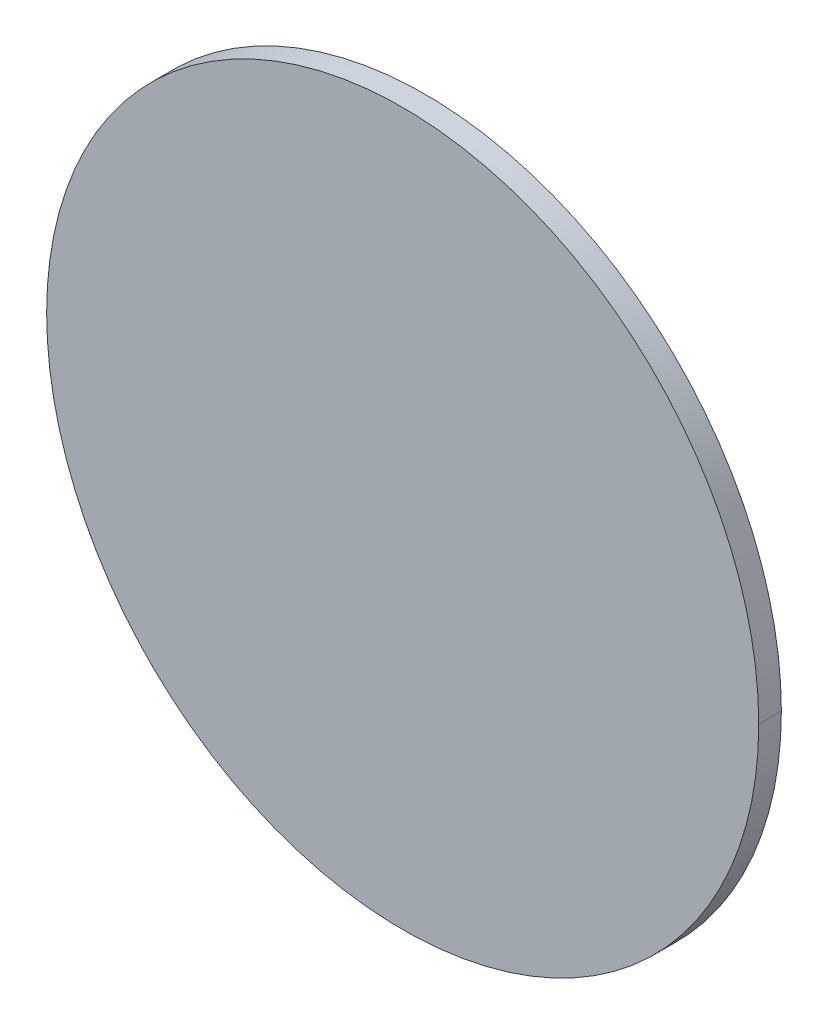
ISO-10303-21;
HEADER;
FILE_DESCRIPTION(('STEP AP214'),'2;1');
FILE_NAME('part.step','',(''),(''),'','','');
FILE_SCHEMA(('AUTOMOTIVE_DESIGN { 1 0 10303 214 1 1 1 1 }'));
ENDSEC;
DATA;
#1=APPLICATION_CONTEXT('core data for automotive mechanical design processes');
#2=APPLICATION_PROTOCOL_DEFINITION('international standard','automotive_design',2000,#1);
#3=PRODUCT_CONTEXT('',#1,'mechanical');
#4=PRODUCT('Part','Part','',(#3));
#5=PRODUCT_RELATED_PRODUCT_CATEGORY('part','',(#4));
#6=PRODUCT_DEFINITION_FORMATION('','',#4);
#7=PRODUCT_DEFINITION_CONTEXT('part definition',#1,'design');
#8=PRODUCT_DEFINITION('design','',#6,#7);
#9=PRODUCT_DEFINITION_SHAPE('','',#8);
#10=(LENGTH_UNIT() NAMED_UNIT(*) SI_UNIT(.MILLI.,.METRE.));
#11=(NAMED_UNIT(*) PLANE_ANGLE_UNIT() SI_UNIT($,.RADIAN.));
#12=(NAMED_UNIT(*) SI_UNIT($,.STERADIAN.) SOLID_ANGLE_UNIT());
#13=UNCERTAINTY_MEASURE_WITH_UNIT(LENGTH_MEASURE(1.E-05),#10,'distance_accuracy_value','');
#14=(GEOMETRIC_REPRESENTATION_CONTEXT(3) GLOBAL_UNCERTAINTY_ASSIGNED_CONTEXT((#13)) GLOBAL_UNIT_ASSIGNED_CONTEXT((#10,
#11,#12)) REPRESENTATION_CONTEXT('',''));
#15=CARTESIAN_POINT('',(0.,0.,0.));
#16=DIRECTION('',(0.,0.,1.));
#17=DIRECTION('',(1.,0.,0.));
#18=AXIS2_PLACEMENT_3D('',#15,#16,#17);
#19=CARTESIAN_POINT('',(38.799998779297,51.099999014835,0.0127));
#20=DIRECTION('',(0.,0.,1.));
#21=DIRECTION('',(1.,0.,0.));
#22=AXIS2_PLACEMENT_3D('',#19,#20,#21);
#23=PLANE('',#22);
#24=CARTESIAN_POINT('',(38.799998779297,51.099999014835,0.0127));
#25=DIRECTION('',(0.,0.,-1.));
#26=DIRECTION('',(1.,0.,0.));
#27=AXIS2_PLACEMENT_3D('',#24,#25,#26);
#28=CIRCLE('',#27,0.200000985169);
#29=CARTESIAN_POINT('',(38.999999764466,51.099999014835,0.0127));
#30=VERTEX_POINT('',#29);
#31=CARTESIAN_POINT('',(38.599997794128,51.099999014835,0.0127));
#32=VERTEX_POINT('',#31);
#33=EDGE_CURVE('E11',#30,#32,#28,.T.);
#34=ORIENTED_EDGE('',*,*,#33,.F.);
#35=CARTESIAN_POINT('',(38.799998779297,51.099999014835,0.0127));
#36=DIRECTION('',(0.,0.,-1.));
#37=DIRECTION('',(1.,0.,0.));
#38=AXIS2_PLACEMENT_3D('',#35,#36,#37);
#39=CIRCLE('',#38,0.200000985169);
#40=EDGE_CURVE('E21',#32,#30,#39,.T.);
#41=ORIENTED_EDGE('',*,*,#40,.F.);
#42=EDGE_LOOP('',(#34,#41));
#43=FACE_BOUND('',#42,.T.);
#44=ADVANCED_FACE('F17',(#43),#23,.T.);
#45=CARTESIAN_POINT('',(38.799998779297,51.099999014835,0.));
#46=DIRECTION('',(0.,0.,1.));
#47=DIRECTION('',(1.,0.,0.));
#48=AXIS2_PLACEMENT_3D('',#45,#46,#47);
#49=CYLINDRICAL_SURFACE('',#48,0.200000985169);
#50=DIRECTION('',(0.,0.,1.));
#51=VECTOR('',#50,1.);
#52=CARTESIAN_POINT('',(38.599997794128,51.099999014835,0.));
#53=LINE('',#52,#51);
#54=CARTESIAN_POINT('',(38.599997794128,51.099999014835,0.));
#55=VERTEX_POINT('',#54);
#56=EDGE_CURVE('E57',#55,#32,#53,.T.);
#57=ORIENTED_EDGE('',*,*,#56,.F.);
#58=CARTESIAN_POINT('',(38.799998779297,51.099999014835,0.));
#59=DIRECTION('',(0.,0.,1.));
#60=DIRECTION('',(1.,0.,0.));
#61=AXIS2_PLACEMENT_3D('',#58,#59,#60);
#62=CIRCLE('',#61,0.200000985169);
#63=CARTESIAN_POINT('',(38.999999764466,51.099999014835,0.));
#64=VERTEX_POINT('',#63);
#65=EDGE_CURVE('E27',#55,#64,#62,.T.);
#66=ORIENTED_EDGE('',*,*,#65,.T.);
#67=DIRECTION('',(0.,0.,1.));
#68=VECTOR('',#67,1.);
#69=CARTESIAN_POINT('',(38.999999764466,51.099999014835,0.));
#70=LINE('',#69,#68);
#71=EDGE_CURVE('E54',#64,#30,#70,.T.);
#72=ORIENTED_EDGE('',*,*,#71,.T.);
#73=ORIENTED_EDGE('',*,*,#33,.T.);
#74=EDGE_LOOP('',(#57,#66,#72,#73));
#75=FACE_BOUND('',#74,.T.);
#76=ADVANCED_FACE('F53',(#75),#49,.T.);
#77=CARTESIAN_POINT('',(38.799998779297,51.099999014835,0.));
#78=DIRECTION('',(0.,0.,1.));
#79=DIRECTION('',(1.,0.,0.));
#80=AXIS2_PLACEMENT_3D('',#77,#78,#79);
#81=PLANE('',#80);
#82=CARTESIAN_POINT('',(38.799998779297,51.099999014835,0.));
#83=DIRECTION('',(0.,0.,1.));
#84=DIRECTION('',(1.,0.,0.));
#85=AXIS2_PLACEMENT_3D('',#82,#83,#84);
#86=CIRCLE('',#85,0.200000985169);
#87=EDGE_CURVE('E64',#64,#55,#86,.T.);
#88=ORIENTED_EDGE('',*,*,#87,.F.);
#89=ORIENTED_EDGE('',*,*,#65,.F.);
#90=EDGE_LOOP('',(#88,#89));
#91=FACE_BOUND('',#90,.T.);
#92=ADVANCED_FACE('F19',(#91),#81,.F.);
#93=CARTESIAN_POINT('',(38.799998779297,51.099999014835,0.));
#94=DIRECTION('',(0.,0.,1.));
#95=DIRECTION('',(1.,0.,0.));
#96=AXIS2_PLACEMENT_3D('',#93,#94,#95);
#97=CYLINDRICAL_SURFACE('',#96,0.200000985169);
#98=ORIENTED_EDGE('',*,*,#87,.T.);
#99=ORIENTED_EDGE('',*,*,#56,.T.);
#100=ORIENTED_EDGE('',*,*,#40,.T.);
#101=ORIENTED_EDGE('',*,*,#71,.F.);
#102=EDGE_LOOP('',(#98,#99,#100,#101));
#103=FACE_BOUND('',#102,.T.);
#104=ADVANCED_FACE('F63',(#103),#97,.T.);
#105=CLOSED_SHELL('',(#44,#76,#92,#104));
#106=MANIFOLD_SOLID_BREP('B1',#105);
#107=ADVANCED_BREP_SHAPE_REPRESENTATION('',(#18,#106),#14);
#108=SHAPE_DEFINITION_REPRESENTATION(#9,#107);
ENDSEC;
END-ISO-10303-21;
